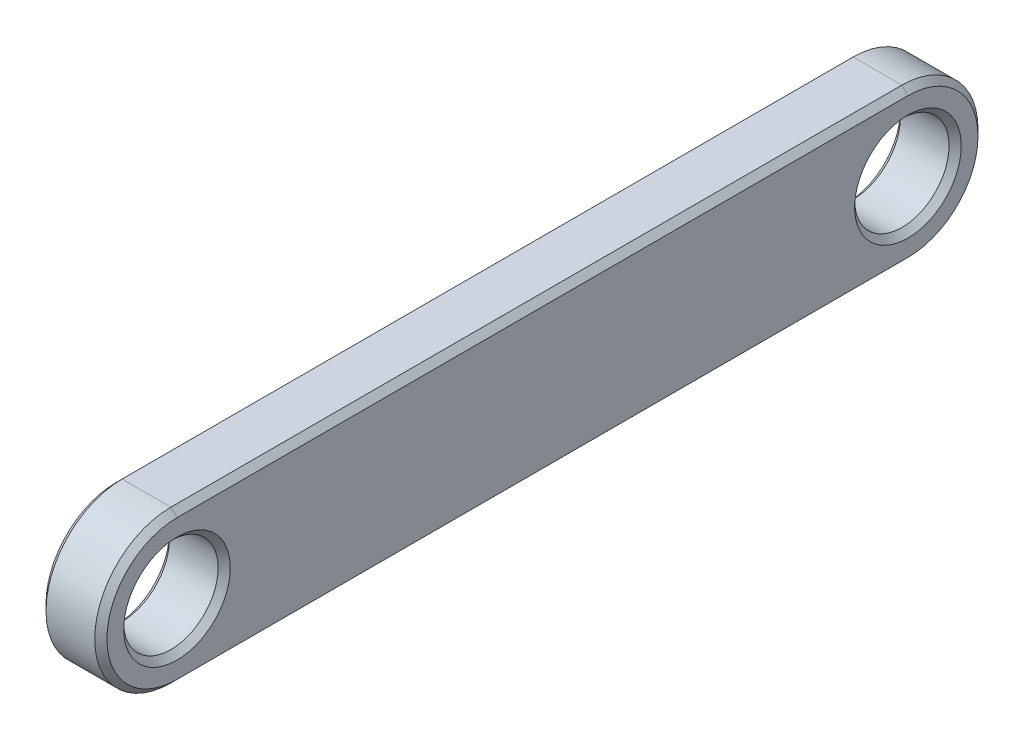
ISO-10303-21;
HEADER;
FILE_DESCRIPTION(('STEP AP214'),'2;1');
FILE_NAME('part.step','',(''),(''),'','','');
FILE_SCHEMA(('AUTOMOTIVE_DESIGN { 1 0 10303 214 1 1 1 1 }'));
ENDSEC;
DATA;
#1=APPLICATION_CONTEXT('core data for automotive mechanical design processes');
#2=APPLICATION_PROTOCOL_DEFINITION('international standard','automotive_design',2000,#1);
#3=PRODUCT_CONTEXT('',#1,'mechanical');
#4=PRODUCT('Part','Part','',(#3));
#5=PRODUCT_RELATED_PRODUCT_CATEGORY('part','',(#4));
#6=PRODUCT_DEFINITION_FORMATION('','',#4);
#7=PRODUCT_DEFINITION_CONTEXT('part definition',#1,'design');
#8=PRODUCT_DEFINITION('design','',#6,#7);
#9=PRODUCT_DEFINITION_SHAPE('','',#8);
#10=(LENGTH_UNIT() NAMED_UNIT(*) SI_UNIT(.MILLI.,.METRE.));
#11=(NAMED_UNIT(*) PLANE_ANGLE_UNIT() SI_UNIT($,.RADIAN.));
#12=(NAMED_UNIT(*) SI_UNIT($,.STERADIAN.) SOLID_ANGLE_UNIT());
#13=UNCERTAINTY_MEASURE_WITH_UNIT(LENGTH_MEASURE(1.E-05),#10,'distance_accuracy_value','');
#14=(GEOMETRIC_REPRESENTATION_CONTEXT(3) GLOBAL_UNCERTAINTY_ASSIGNED_CONTEXT((#13)) GLOBAL_UNIT_ASSIGNED_CONTEXT((#10,
#11,#12)) REPRESENTATION_CONTEXT('',''));
#15=CARTESIAN_POINT('',(0.,0.,0.));
#16=DIRECTION('',(0.,0.,1.));
#17=DIRECTION('',(1.,0.,0.));
#18=AXIS2_PLACEMENT_3D('',#15,#16,#17);
#19=CARTESIAN_POINT('',(2.,0.,12.));
#20=DIRECTION('',(1.,0.,0.));
#21=DIRECTION('',(0.,0.,-1.));
#22=AXIS2_PLACEMENT_3D('',#19,#20,#21);
#23=PLANE('',#22);
#24=CARTESIAN_POINT('',(2.,0.,-12.));
#25=DIRECTION('',(1.,0.,0.));
#26=DIRECTION('',(0.,0.,-1.));
#27=AXIS2_PLACEMENT_3D('',#24,#25,#26);
#28=CIRCLE('',#27,1.75);
#29=CARTESIAN_POINT('',(2.,0.,-13.75));
#30=VERTEX_POINT('',#29);
#31=EDGE_CURVE('E11',#30,#30,#28,.F.);
#32=ORIENTED_EDGE('',*,*,#31,.T.);
#33=EDGE_LOOP('',(#32));
#34=FACE_BOUND('',#33,.T.);
#35=CARTESIAN_POINT('',(2.,0.,-12.));
#36=DIRECTION('',(1.,0.,0.));
#37=DIRECTION('',(0.,0.,-1.));
#38=AXIS2_PLACEMENT_3D('',#35,#36,#37);
#39=CIRCLE('',#38,2.3);
#40=CARTESIAN_POINT('',(2.,-2.3,-12.));
#41=VERTEX_POINT('',#40);
#42=CARTESIAN_POINT('',(2.,2.3,-12.));
#43=VERTEX_POINT('',#42);
#44=EDGE_CURVE('E53',#41,#43,#39,.T.);
#45=ORIENTED_EDGE('',*,*,#44,.T.);
#46=DIRECTION('',(0.,0.,1.));
#47=VECTOR('',#46,1.);
#48=CARTESIAN_POINT('',(2.,2.3,12.));
#49=LINE('',#48,#47);
#50=CARTESIAN_POINT('',(2.,2.3,12.));
#51=VERTEX_POINT('',#50);
#52=EDGE_CURVE('E45',#43,#51,#49,.T.);
#53=ORIENTED_EDGE('',*,*,#52,.T.);
#54=CARTESIAN_POINT('',(2.,0.,12.));
#55=DIRECTION('',(1.,0.,0.));
#56=DIRECTION('',(0.,0.,-1.));
#57=AXIS2_PLACEMENT_3D('',#54,#55,#56);
#58=CIRCLE('',#57,2.3);
#59=CARTESIAN_POINT('',(2.,-2.3,12.));
#60=VERTEX_POINT('',#59);
#61=EDGE_CURVE('E171',#51,#60,#58,.T.);
#62=ORIENTED_EDGE('',*,*,#61,.T.);
#63=DIRECTION('',(0.,0.,-1.));
#64=VECTOR('',#63,1.);
#65=CARTESIAN_POINT('',(2.,-2.3,-12.));
#66=LINE('',#65,#64);
#67=EDGE_CURVE('E58',#60,#41,#66,.T.);
#68=ORIENTED_EDGE('',*,*,#67,.T.);
#69=EDGE_LOOP('',(#45,#53,#62,#68));
#70=FACE_BOUND('',#69,.T.);
#71=CARTESIAN_POINT('',(2.,0.,12.));
#72=DIRECTION('',(1.,0.,0.));
#73=DIRECTION('',(0.,0.,-1.));
#74=AXIS2_PLACEMENT_3D('',#71,#72,#73);
#75=CIRCLE('',#74,1.74999999999999);
#76=CARTESIAN_POINT('',(2.,0.,10.25));
#77=VERTEX_POINT('',#76);
#78=EDGE_CURVE('E168',#77,#77,#75,.F.);
#79=ORIENTED_EDGE('',*,*,#78,.T.);
#80=EDGE_LOOP('',(#79));
#81=FACE_BOUND('',#80,.T.);
#82=ADVANCED_FACE('F35',(#34,#70,#81),#23,.T.);
#83=CARTESIAN_POINT('',(0.,0.,12.));
#84=DIRECTION('',(1.,0.,0.));
#85=DIRECTION('',(0.,0.,-1.));
#86=AXIS2_PLACEMENT_3D('',#83,#84,#85);
#87=PLANE('',#86);
#88=CARTESIAN_POINT('',(0.,0.,-12.));
#89=DIRECTION('',(1.,0.,0.));
#90=DIRECTION('',(0.,0.,-1.));
#91=AXIS2_PLACEMENT_3D('',#88,#89,#90);
#92=CIRCLE('',#91,1.75);
#93=CARTESIAN_POINT('',(0.,0.,-13.75));
#94=VERTEX_POINT('',#93);
#95=EDGE_CURVE('E133',#94,#94,#92,.T.);
#96=ORIENTED_EDGE('',*,*,#95,.T.);
#97=EDGE_LOOP('',(#96));
#98=FACE_BOUND('',#97,.T.);
#99=CARTESIAN_POINT('',(0.,0.,12.));
#100=DIRECTION('',(1.,0.,0.));
#101=DIRECTION('',(0.,0.,-1.));
#102=AXIS2_PLACEMENT_3D('',#99,#100,#101);
#103=CIRCLE('',#102,1.75);
#104=CARTESIAN_POINT('',(0.,0.,10.25));
#105=VERTEX_POINT('',#104);
#106=EDGE_CURVE('E130',#105,#105,#103,.T.);
#107=ORIENTED_EDGE('',*,*,#106,.T.);
#108=EDGE_LOOP('',(#107));
#109=FACE_BOUND('',#108,.T.);
#110=CARTESIAN_POINT('',(0.,0.,-12.));
#111=DIRECTION('',(1.,0.,0.));
#112=DIRECTION('',(0.,0.,-1.));
#113=AXIS2_PLACEMENT_3D('',#110,#111,#112);
#114=CIRCLE('',#113,2.3);
#115=CARTESIAN_POINT('',(0.,2.3,-12.));
#116=VERTEX_POINT('',#115);
#117=CARTESIAN_POINT('',(0.,-2.3,-12.));
#118=VERTEX_POINT('',#117);
#119=EDGE_CURVE('E129',#116,#118,#114,.F.);
#120=ORIENTED_EDGE('',*,*,#119,.T.);
#121=DIRECTION('',(0.,0.,1.));
#122=VECTOR('',#121,1.);
#123=CARTESIAN_POINT('',(0.,-2.3,12.));
#124=LINE('',#123,#122);
#125=CARTESIAN_POINT('',(0.,-2.3,12.));
#126=VERTEX_POINT('',#125);
#127=EDGE_CURVE('E108',#118,#126,#124,.T.);
#128=ORIENTED_EDGE('',*,*,#127,.T.);
#129=CARTESIAN_POINT('',(0.,0.,12.));
#130=DIRECTION('',(1.,0.,0.));
#131=DIRECTION('',(0.,0.,-1.));
#132=AXIS2_PLACEMENT_3D('',#129,#130,#131);
#133=CIRCLE('',#132,2.3);
#134=CARTESIAN_POINT('',(0.,2.3,12.));
#135=VERTEX_POINT('',#134);
#136=EDGE_CURVE('E118',#126,#135,#133,.F.);
#137=ORIENTED_EDGE('',*,*,#136,.T.);
#138=DIRECTION('',(0.,0.,-1.));
#139=VECTOR('',#138,1.);
#140=CARTESIAN_POINT('',(0.,2.3,12.));
#141=LINE('',#140,#139);
#142=EDGE_CURVE('E124',#135,#116,#141,.T.);
#143=ORIENTED_EDGE('',*,*,#142,.T.);
#144=EDGE_LOOP('',(#120,#128,#137,#143));
#145=FACE_BOUND('',#144,.T.);
#146=ADVANCED_FACE('F127',(#98,#109,#145),#87,.F.);
#147=CARTESIAN_POINT('',(2.,0.,12.));
#148=DIRECTION('',(-1.,0.,0.));
#149=DIRECTION('',(0.,0.,1.));
#150=AXIS2_PLACEMENT_3D('',#147,#148,#149);
#151=CYLINDRICAL_SURFACE('',#150,2.50000000000001);
#152=DIRECTION('',(-1.,0.,0.));
#153=VECTOR('',#152,1.);
#154=CARTESIAN_POINT('',(2.,2.50000000000001,12.));
#155=LINE('',#154,#153);
#156=CARTESIAN_POINT('',(1.8,2.50000000000001,12.));
#157=VERTEX_POINT('',#156);
#158=CARTESIAN_POINT('',(0.200000000000001,2.50000000000001,12.));
#159=VERTEX_POINT('',#158);
#160=EDGE_CURVE('E180',#157,#159,#155,.T.);
#161=ORIENTED_EDGE('',*,*,#160,.T.);
#162=CARTESIAN_POINT('',(0.200000000000001,0.,12.));
#163=DIRECTION('',(1.,0.,0.));
#164=DIRECTION('',(0.,0.,-1.));
#165=AXIS2_PLACEMENT_3D('',#162,#163,#164);
#166=CIRCLE('',#165,2.50000000000001);
#167=CARTESIAN_POINT('',(0.200000000000001,-2.50000000000001,12.));
#168=VERTEX_POINT('',#167);
#169=EDGE_CURVE('E166',#159,#168,#166,.T.);
#170=ORIENTED_EDGE('',*,*,#169,.T.);
#171=DIRECTION('',(-1.,0.,0.));
#172=VECTOR('',#171,1.);
#173=CARTESIAN_POINT('',(2.,-2.50000000000001,12.));
#174=LINE('',#173,#172);
#175=CARTESIAN_POINT('',(1.8,-2.50000000000001,12.));
#176=VERTEX_POINT('',#175);
#177=EDGE_CURVE('E125',#176,#168,#174,.T.);
#178=ORIENTED_EDGE('',*,*,#177,.F.);
#179=CARTESIAN_POINT('',(1.8,0.,12.));
#180=DIRECTION('',(1.,0.,0.));
#181=DIRECTION('',(0.,0.,-1.));
#182=AXIS2_PLACEMENT_3D('',#179,#180,#181);
#183=CIRCLE('',#182,2.50000000000001);
#184=EDGE_CURVE('E164',#176,#157,#183,.F.);
#185=ORIENTED_EDGE('',*,*,#184,.T.);
#186=EDGE_LOOP('',(#161,#170,#178,#185));
#187=FACE_BOUND('',#186,.T.);
#188=ADVANCED_FACE('F206',(#187),#151,.T.);
#189=CARTESIAN_POINT('',(2.,-2.50000000000001,12.));
#190=DIRECTION('',(0.,1.,0.));
#191=DIRECTION('',(0.,0.,1.));
#192=AXIS2_PLACEMENT_3D('',#189,#190,#191);
#193=PLANE('',#192);
#194=ORIENTED_EDGE('',*,*,#177,.T.);
#195=DIRECTION('',(0.,0.,-1.));
#196=VECTOR('',#195,1.);
#197=CARTESIAN_POINT('',(0.200000000000001,-2.50000000000001,12.));
#198=LINE('',#197,#196);
#199=CARTESIAN_POINT('',(0.200000000000001,-2.50000000000001,-12.));
#200=VERTEX_POINT('',#199);
#201=EDGE_CURVE('E111',#168,#200,#198,.T.);
#202=ORIENTED_EDGE('',*,*,#201,.T.);
#203=DIRECTION('',(-1.,0.,0.));
#204=VECTOR('',#203,1.);
#205=CARTESIAN_POINT('',(2.,-2.50000000000001,-12.));
#206=LINE('',#205,#204);
#207=CARTESIAN_POINT('',(1.8,-2.50000000000001,-12.));
#208=VERTEX_POINT('',#207);
#209=EDGE_CURVE('E203',#208,#200,#206,.T.);
#210=ORIENTED_EDGE('',*,*,#209,.F.);
#211=DIRECTION('',(0.,0.,1.));
#212=VECTOR('',#211,1.);
#213=CARTESIAN_POINT('',(1.8,-2.50000000000001,12.));
#214=LINE('',#213,#212);
#215=EDGE_CURVE('E152',#208,#176,#214,.T.);
#216=ORIENTED_EDGE('',*,*,#215,.T.);
#217=EDGE_LOOP('',(#194,#202,#210,#216));
#218=FACE_BOUND('',#217,.T.);
#219=ADVANCED_FACE('F201',(#218),#193,.F.);
#220=CARTESIAN_POINT('',(2.,0.,-12.));
#221=DIRECTION('',(-1.,0.,0.));
#222=DIRECTION('',(0.,0.,1.));
#223=AXIS2_PLACEMENT_3D('',#220,#221,#222);
#224=CYLINDRICAL_SURFACE('',#223,2.50000000000001);
#225=ORIENTED_EDGE('',*,*,#209,.T.);
#226=CARTESIAN_POINT('',(0.200000000000001,0.,-12.));
#227=DIRECTION('',(1.,0.,0.));
#228=DIRECTION('',(0.,0.,-1.));
#229=AXIS2_PLACEMENT_3D('',#226,#227,#228);
#230=CIRCLE('',#229,2.50000000000001);
#231=CARTESIAN_POINT('',(0.200000000000001,2.50000000000001,-12.));
#232=VERTEX_POINT('',#231);
#233=EDGE_CURVE('E157',#200,#232,#230,.T.);
#234=ORIENTED_EDGE('',*,*,#233,.T.);
#235=DIRECTION('',(-1.,0.,0.));
#236=VECTOR('',#235,1.);
#237=CARTESIAN_POINT('',(2.,2.50000000000001,-12.));
#238=LINE('',#237,#236);
#239=CARTESIAN_POINT('',(1.8,2.50000000000001,-12.));
#240=VERTEX_POINT('',#239);
#241=EDGE_CURVE('E209',#240,#232,#238,.T.);
#242=ORIENTED_EDGE('',*,*,#241,.F.);
#243=CARTESIAN_POINT('',(1.8,0.,-12.));
#244=DIRECTION('',(1.,0.,0.));
#245=DIRECTION('',(0.,0.,-1.));
#246=AXIS2_PLACEMENT_3D('',#243,#244,#245);
#247=CIRCLE('',#246,2.50000000000001);
#248=EDGE_CURVE('E155',#240,#208,#247,.F.);
#249=ORIENTED_EDGE('',*,*,#248,.T.);
#250=EDGE_LOOP('',(#225,#234,#242,#249));
#251=FACE_BOUND('',#250,.T.);
#252=ADVANCED_FACE('F222',(#251),#224,.T.);
#253=CARTESIAN_POINT('',(2.,2.50000000000001,12.));
#254=DIRECTION('',(0.,-1.,0.));
#255=DIRECTION('',(0.,0.,-1.));
#256=AXIS2_PLACEMENT_3D('',#253,#254,#255);
#257=PLANE('',#256);
#258=ORIENTED_EDGE('',*,*,#241,.T.);
#259=DIRECTION('',(0.,0.,1.));
#260=VECTOR('',#259,1.);
#261=CARTESIAN_POINT('',(0.200000000000001,2.50000000000001,12.));
#262=LINE('',#261,#260);
#263=EDGE_CURVE('E162',#232,#159,#262,.T.);
#264=ORIENTED_EDGE('',*,*,#263,.T.);
#265=ORIENTED_EDGE('',*,*,#160,.F.);
#266=DIRECTION('',(0.,0.,-1.));
#267=VECTOR('',#266,1.);
#268=CARTESIAN_POINT('',(1.8,2.50000000000001,-12.));
#269=LINE('',#268,#267);
#270=EDGE_CURVE('E159',#157,#240,#269,.T.);
#271=ORIENTED_EDGE('',*,*,#270,.T.);
#272=EDGE_LOOP('',(#258,#264,#265,#271));
#273=FACE_BOUND('',#272,.T.);
#274=ADVANCED_FACE('F226',(#273),#257,.F.);
#275=CARTESIAN_POINT('',(2.,0.,12.));
#276=DIRECTION('',(-1.,0.,0.));
#277=DIRECTION('',(0.,0.,1.));
#278=AXIS2_PLACEMENT_3D('',#275,#276,#277);
#279=CYLINDRICAL_SURFACE('',#278,1.55);
#280=CARTESIAN_POINT('',(0.200000000000001,0.,12.));
#281=DIRECTION('',(1.,0.,0.));
#282=DIRECTION('',(0.,0.,-1.));
#283=AXIS2_PLACEMENT_3D('',#280,#281,#282);
#284=CIRCLE('',#283,1.55);
#285=CARTESIAN_POINT('',(0.200000000000001,0.,10.45));
#286=VERTEX_POINT('',#285);
#287=EDGE_CURVE('E149',#286,#286,#284,.F.);
#288=ORIENTED_EDGE('',*,*,#287,.T.);
#289=EDGE_LOOP('',(#288));
#290=FACE_BOUND('',#289,.T.);
#291=CARTESIAN_POINT('',(1.80000000000001,0.,12.));
#292=DIRECTION('',(1.,0.,0.));
#293=DIRECTION('',(0.,0.,-1.));
#294=AXIS2_PLACEMENT_3D('',#291,#292,#293);
#295=CIRCLE('',#294,1.55);
#296=CARTESIAN_POINT('',(1.80000000000001,0.,10.45));
#297=VERTEX_POINT('',#296);
#298=EDGE_CURVE('E146',#297,#297,#295,.T.);
#299=ORIENTED_EDGE('',*,*,#298,.T.);
#300=EDGE_LOOP('',(#299));
#301=FACE_BOUND('',#300,.T.);
#302=ADVANCED_FACE('F242',(#290,#301),#279,.F.);
#303=CARTESIAN_POINT('',(2.,0.,-12.));
#304=DIRECTION('',(-1.,0.,0.));
#305=DIRECTION('',(0.,0.,1.));
#306=AXIS2_PLACEMENT_3D('',#303,#304,#305);
#307=CYLINDRICAL_SURFACE('',#306,1.55);
#308=CARTESIAN_POINT('',(0.200000000000001,0.,-12.));
#309=DIRECTION('',(1.,0.,0.));
#310=DIRECTION('',(0.,0.,-1.));
#311=AXIS2_PLACEMENT_3D('',#308,#309,#310);
#312=CIRCLE('',#311,1.55);
#313=CARTESIAN_POINT('',(0.200000000000001,0.,-13.55));
#314=VERTEX_POINT('',#313);
#315=EDGE_CURVE('E143',#314,#314,#312,.F.);
#316=ORIENTED_EDGE('',*,*,#315,.T.);
#317=EDGE_LOOP('',(#316));
#318=FACE_BOUND('',#317,.T.);
#319=CARTESIAN_POINT('',(1.8,0.,-12.));
#320=DIRECTION('',(1.,0.,0.));
#321=DIRECTION('',(0.,0.,-1.));
#322=AXIS2_PLACEMENT_3D('',#319,#320,#321);
#323=CIRCLE('',#322,1.55);
#324=CARTESIAN_POINT('',(1.8,0.,-13.55));
#325=VERTEX_POINT('',#324);
#326=EDGE_CURVE('E140',#325,#325,#323,.T.);
#327=ORIENTED_EDGE('',*,*,#326,.T.);
#328=EDGE_LOOP('',(#327));
#329=FACE_BOUND('',#328,.T.);
#330=ADVANCED_FACE('F244',(#318,#329),#307,.F.);
#331=CARTESIAN_POINT('',(0.,0.,-12.));
#332=DIRECTION('',(-1.,0.,0.));
#333=DIRECTION('',(0.,0.,1.));
#334=AXIS2_PLACEMENT_3D('',#331,#332,#333);
#335=CONICAL_SURFACE('',#334,1.75,0.785398163397443);
#336=ORIENTED_EDGE('',*,*,#315,.F.);
#337=EDGE_LOOP('',(#336));
#338=FACE_BOUND('',#337,.T.);
#339=ORIENTED_EDGE('',*,*,#95,.F.);
#340=EDGE_LOOP('',(#339));
#341=FACE_BOUND('',#340,.T.);
#342=ADVANCED_FACE('F251',(#338,#341),#335,.F.);
#343=CARTESIAN_POINT('',(0.,0.,12.));
#344=DIRECTION('',(-1.,0.,0.));
#345=DIRECTION('',(0.,0.,1.));
#346=AXIS2_PLACEMENT_3D('',#343,#344,#345);
#347=CONICAL_SURFACE('',#346,1.75,0.785398163397443);
#348=ORIENTED_EDGE('',*,*,#287,.F.);
#349=EDGE_LOOP('',(#348));
#350=FACE_BOUND('',#349,.T.);
#351=ORIENTED_EDGE('',*,*,#106,.F.);
#352=EDGE_LOOP('',(#351));
#353=FACE_BOUND('',#352,.T.);
#354=ADVANCED_FACE('F271',(#350,#353),#347,.F.);
#355=CARTESIAN_POINT('',(0.200000000000001,2.50000000000001,12.));
#356=DIRECTION('',(0.707106781186552,-0.707106781186543,0.));
#357=DIRECTION('',(0.,0.,1.));
#358=AXIS2_PLACEMENT_3D('',#355,#356,#357);
#359=PLANE('',#358);
#360=DIRECTION('',(0.707106781186543,0.707106781186552,0.));
#361=VECTOR('',#360,1.);
#362=CARTESIAN_POINT('',(0.,2.3,-12.));
#363=LINE('',#362,#361);
#364=EDGE_CURVE('E114',#116,#232,#363,.T.);
#365=ORIENTED_EDGE('',*,*,#364,.F.);
#366=ORIENTED_EDGE('',*,*,#142,.F.);
#367=DIRECTION('',(-0.707106781186543,-0.707106781186552,0.));
#368=VECTOR('',#367,1.);
#369=CARTESIAN_POINT('',(0.200000000000001,2.50000000000001,12.));
#370=LINE('',#369,#368);
#371=EDGE_CURVE('E121',#159,#135,#370,.T.);
#372=ORIENTED_EDGE('',*,*,#371,.F.);
#373=ORIENTED_EDGE('',*,*,#263,.F.);
#374=EDGE_LOOP('',(#365,#366,#372,#373));
#375=FACE_BOUND('',#374,.T.);
#376=ADVANCED_FACE('F215',(#375),#359,.F.);
#377=CARTESIAN_POINT('',(0.200000000000001,0.,12.));
#378=DIRECTION('',(1.,0.,0.));
#379=DIRECTION('',(0.,0.,-1.));
#380=AXIS2_PLACEMENT_3D('',#377,#378,#379);
#381=CONICAL_SURFACE('',#380,2.50000000000001,0.785398163397455);
#382=ORIENTED_EDGE('',*,*,#371,.T.);
#383=ORIENTED_EDGE('',*,*,#136,.F.);
#384=DIRECTION('',(-0.707106781186543,0.707106781186552,0.));
#385=VECTOR('',#384,1.);
#386=CARTESIAN_POINT('',(0.200000000000001,-2.50000000000001,12.));
#387=LINE('',#386,#385);
#388=EDGE_CURVE('E104',#168,#126,#387,.T.);
#389=ORIENTED_EDGE('',*,*,#388,.F.);
#390=ORIENTED_EDGE('',*,*,#169,.F.);
#391=EDGE_LOOP('',(#382,#383,#389,#390));
#392=FACE_BOUND('',#391,.T.);
#393=ADVANCED_FACE('F119',(#392),#381,.T.);
#394=CARTESIAN_POINT('',(0.200000000000001,0.,-12.));
#395=DIRECTION('',(1.,0.,0.));
#396=DIRECTION('',(0.,0.,-1.));
#397=AXIS2_PLACEMENT_3D('',#394,#395,#396);
#398=CONICAL_SURFACE('',#397,2.50000000000001,0.785398163397455);
#399=ORIENTED_EDGE('',*,*,#364,.T.);
#400=ORIENTED_EDGE('',*,*,#233,.F.);
#401=DIRECTION('',(0.707106781186543,-0.707106781186552,0.));
#402=VECTOR('',#401,1.);
#403=CARTESIAN_POINT('',(0.,-2.3,-12.));
#404=LINE('',#403,#402);
#405=EDGE_CURVE('E115',#118,#200,#404,.T.);
#406=ORIENTED_EDGE('',*,*,#405,.F.);
#407=ORIENTED_EDGE('',*,*,#119,.F.);
#408=EDGE_LOOP('',(#399,#400,#406,#407));
#409=FACE_BOUND('',#408,.T.);
#410=ADVANCED_FACE('F218',(#409),#398,.T.);
#411=CARTESIAN_POINT('',(0.200000000000001,-2.50000000000001,12.));
#412=DIRECTION('',(0.707106781186552,0.707106781186543,0.));
#413=DIRECTION('',(0.,0.,-1.));
#414=AXIS2_PLACEMENT_3D('',#411,#412,#413);
#415=PLANE('',#414);
#416=ORIENTED_EDGE('',*,*,#388,.T.);
#417=ORIENTED_EDGE('',*,*,#127,.F.);
#418=ORIENTED_EDGE('',*,*,#405,.T.);
#419=ORIENTED_EDGE('',*,*,#201,.F.);
#420=EDGE_LOOP('',(#416,#417,#418,#419));
#421=FACE_BOUND('',#420,.T.);
#422=ADVANCED_FACE('F106',(#421),#415,.F.);
#423=CARTESIAN_POINT('',(1.8,0.,-12.));
#424=DIRECTION('',(1.,0.,0.));
#425=DIRECTION('',(0.,0.,-1.));
#426=AXIS2_PLACEMENT_3D('',#423,#424,#425);
#427=CONICAL_SURFACE('',#426,1.55,0.785398163397454);
#428=ORIENTED_EDGE('',*,*,#31,.F.);
#429=EDGE_LOOP('',(#428));
#430=FACE_BOUND('',#429,.T.);
#431=ORIENTED_EDGE('',*,*,#326,.F.);
#432=EDGE_LOOP('',(#431));
#433=FACE_BOUND('',#432,.T.);
#434=ADVANCED_FACE('F286',(#430,#433),#427,.F.);
#435=CARTESIAN_POINT('',(2.,-2.3,12.));
#436=DIRECTION('',(0.707106781186549,-0.707106781186546,0.));
#437=DIRECTION('',(0.,0.,1.));
#438=AXIS2_PLACEMENT_3D('',#435,#436,#437);
#439=PLANE('',#438);
#440=DIRECTION('',(0.707106781186546,0.707106781186549,0.));
#441=VECTOR('',#440,1.);
#442=CARTESIAN_POINT('',(1.8,-2.50000000000001,12.));
#443=LINE('',#442,#441);
#444=EDGE_CURVE('E184',#176,#60,#443,.T.);
#445=ORIENTED_EDGE('',*,*,#444,.F.);
#446=ORIENTED_EDGE('',*,*,#215,.F.);
#447=DIRECTION('',(-0.707106781186546,-0.707106781186549,0.));
#448=VECTOR('',#447,1.);
#449=CARTESIAN_POINT('',(2.,-2.3,-12.));
#450=LINE('',#449,#448);
#451=EDGE_CURVE('E40',#41,#208,#450,.T.);
#452=ORIENTED_EDGE('',*,*,#451,.F.);
#453=ORIENTED_EDGE('',*,*,#67,.F.);
#454=EDGE_LOOP('',(#445,#446,#452,#453));
#455=FACE_BOUND('',#454,.T.);
#456=ADVANCED_FACE('F196',(#455),#439,.T.);
#457=CARTESIAN_POINT('',(2.,0.,-12.));
#458=DIRECTION('',(-1.,0.,0.));
#459=DIRECTION('',(0.,0.,1.));
#460=AXIS2_PLACEMENT_3D('',#457,#458,#459);
#461=CONICAL_SURFACE('',#460,2.3,0.78539816339745);
#462=ORIENTED_EDGE('',*,*,#451,.T.);
#463=ORIENTED_EDGE('',*,*,#248,.F.);
#464=DIRECTION('',(-0.707106781186546,0.707106781186549,0.));
#465=VECTOR('',#464,1.);
#466=CARTESIAN_POINT('',(2.,2.3,-12.));
#467=LINE('',#466,#465);
#468=EDGE_CURVE('E183',#43,#240,#467,.T.);
#469=ORIENTED_EDGE('',*,*,#468,.F.);
#470=ORIENTED_EDGE('',*,*,#44,.F.);
#471=EDGE_LOOP('',(#462,#463,#469,#470));
#472=FACE_BOUND('',#471,.T.);
#473=ADVANCED_FACE('F193',(#472),#461,.T.);
#474=CARTESIAN_POINT('',(2.,0.,12.));
#475=DIRECTION('',(-1.,0.,0.));
#476=DIRECTION('',(0.,0.,1.));
#477=AXIS2_PLACEMENT_3D('',#474,#475,#476);
#478=CONICAL_SURFACE('',#477,2.3,0.78539816339745);
#479=ORIENTED_EDGE('',*,*,#444,.T.);
#480=ORIENTED_EDGE('',*,*,#61,.F.);
#481=DIRECTION('',(0.707106781186546,-0.707106781186549,0.));
#482=VECTOR('',#481,1.);
#483=CARTESIAN_POINT('',(1.8,2.50000000000001,12.));
#484=LINE('',#483,#482);
#485=EDGE_CURVE('E181',#157,#51,#484,.T.);
#486=ORIENTED_EDGE('',*,*,#485,.F.);
#487=ORIENTED_EDGE('',*,*,#184,.F.);
#488=EDGE_LOOP('',(#479,#480,#486,#487));
#489=FACE_BOUND('',#488,.T.);
#490=ADVANCED_FACE('F231',(#489),#478,.T.);
#491=CARTESIAN_POINT('',(2.,2.3,12.));
#492=DIRECTION('',(0.707106781186549,0.707106781186546,0.));
#493=DIRECTION('',(0.,0.,-1.));
#494=AXIS2_PLACEMENT_3D('',#491,#492,#493);
#495=PLANE('',#494);
#496=ORIENTED_EDGE('',*,*,#468,.T.);
#497=ORIENTED_EDGE('',*,*,#270,.F.);
#498=ORIENTED_EDGE('',*,*,#485,.T.);
#499=ORIENTED_EDGE('',*,*,#52,.F.);
#500=EDGE_LOOP('',(#496,#497,#498,#499));
#501=FACE_BOUND('',#500,.T.);
#502=ADVANCED_FACE('F229',(#501),#495,.T.);
#503=CARTESIAN_POINT('',(1.80000000000001,0.,12.));
#504=DIRECTION('',(1.,0.,0.));
#505=DIRECTION('',(0.,0.,-1.));
#506=AXIS2_PLACEMENT_3D('',#503,#504,#505);
#507=CONICAL_SURFACE('',#506,1.55,0.785398163397454);
#508=ORIENTED_EDGE('',*,*,#78,.F.);
#509=EDGE_LOOP('',(#508));
#510=FACE_BOUND('',#509,.T.);
#511=ORIENTED_EDGE('',*,*,#298,.F.);
#512=EDGE_LOOP('',(#511));
#513=FACE_BOUND('',#512,.T.);
#514=ADVANCED_FACE('F38',(#510,#513),#507,.F.);
#515=CLOSED_SHELL('',(#82,#146,#188,#219,#252,#274,#302,#330,#342,#354,#376,#393,#410,#422,#434,
#456,#473,#490,#502,#514));
#516=MANIFOLD_SOLID_BREP('B2',#515);
#517=ADVANCED_BREP_SHAPE_REPRESENTATION('',(#18,#516),#14);
#518=SHAPE_DEFINITION_REPRESENTATION(#9,#517);
ENDSEC;
END-ISO-10303-21;
